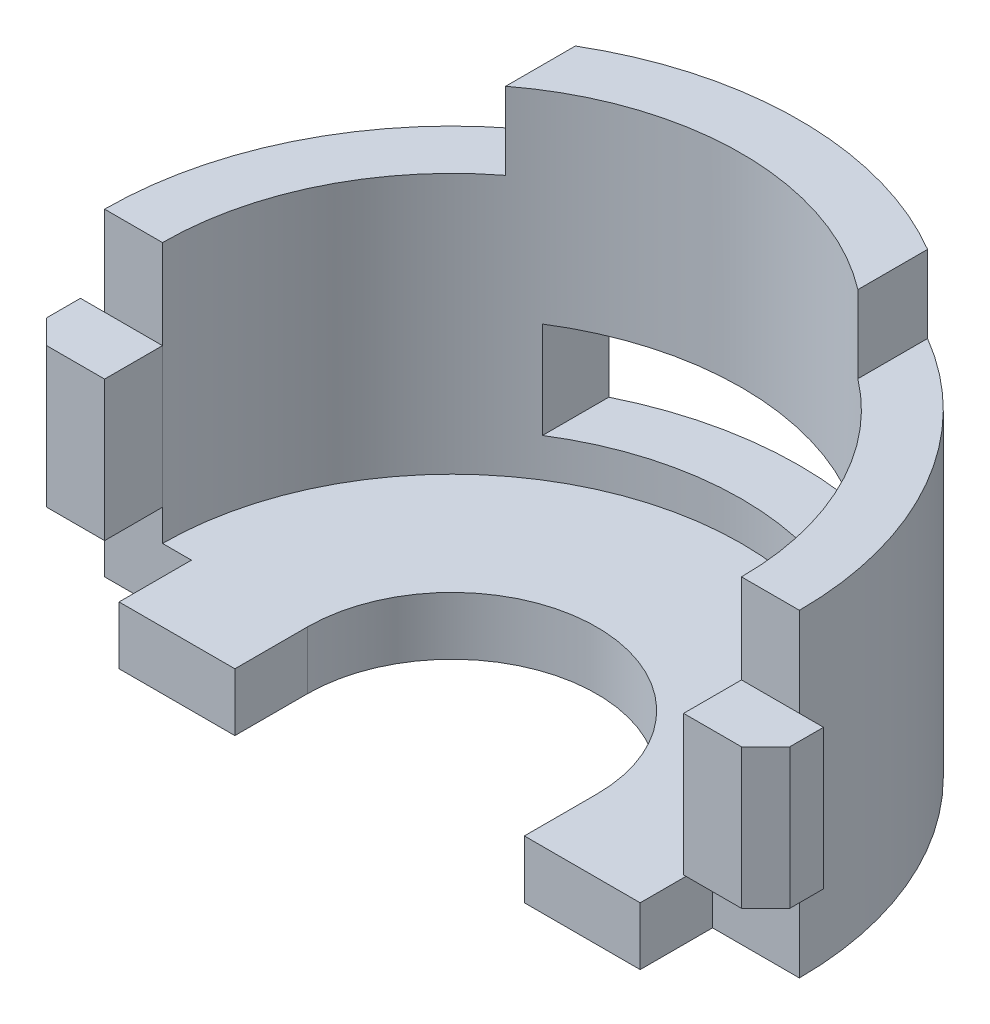
ISO-10303-21;
HEADER;
FILE_DESCRIPTION(('STEP AP214'),'2;1');
FILE_NAME('part.step','',(''),(''),'','','');
FILE_SCHEMA(('AUTOMOTIVE_DESIGN { 1 0 10303 214 1 1 1 1 }'));
ENDSEC;
DATA;
#1=APPLICATION_CONTEXT('core data for automotive mechanical design processes');
#2=APPLICATION_PROTOCOL_DEFINITION('international standard','automotive_design',2000,#1);
#3=PRODUCT_CONTEXT('',#1,'mechanical');
#4=PRODUCT('Part','Part','',(#3));
#5=PRODUCT_RELATED_PRODUCT_CATEGORY('part','',(#4));
#6=PRODUCT_DEFINITION_FORMATION('','',#4);
#7=PRODUCT_DEFINITION_CONTEXT('part definition',#1,'design');
#8=PRODUCT_DEFINITION('design','',#6,#7);
#9=PRODUCT_DEFINITION_SHAPE('','',#8);
#10=(LENGTH_UNIT() NAMED_UNIT(*) SI_UNIT(.MILLI.,.METRE.));
#11=(NAMED_UNIT(*) PLANE_ANGLE_UNIT() SI_UNIT($,.RADIAN.));
#12=(NAMED_UNIT(*) SI_UNIT($,.STERADIAN.) SOLID_ANGLE_UNIT());
#13=UNCERTAINTY_MEASURE_WITH_UNIT(LENGTH_MEASURE(1.E-05),#10,'distance_accuracy_value','');
#14=(GEOMETRIC_REPRESENTATION_CONTEXT(3) GLOBAL_UNCERTAINTY_ASSIGNED_CONTEXT((#13)) GLOBAL_UNIT_ASSIGNED_CONTEXT((#10,
#11,#12)) REPRESENTATION_CONTEXT('',''));
#15=CARTESIAN_POINT('',(0.,0.,0.));
#16=DIRECTION('',(0.,0.,1.));
#17=DIRECTION('',(1.,0.,0.));
#18=AXIS2_PLACEMENT_3D('',#15,#16,#17);
#19=CARTESIAN_POINT('',(0.,0.,0.));
#20=DIRECTION('',(0.,0.,-1.));
#21=DIRECTION('',(-1.,0.,0.));
#22=AXIS2_PLACEMENT_3D('',#19,#20,#21);
#23=PLANE('',#22);
#24=DIRECTION('',(-1.,0.,0.));
#25=VECTOR('',#24,1.);
#26=CARTESIAN_POINT('',(7.7,3.55,0.));
#27=LINE('',#26,#25);
#28=CARTESIAN_POINT('',(7.2,3.55,0.));
#29=VERTEX_POINT('',#28);
#30=CARTESIAN_POINT('',(6.,3.55,0.));
#31=VERTEX_POINT('',#30);
#32=EDGE_CURVE('E280',#29,#31,#27,.T.);
#33=ORIENTED_EDGE('',*,*,#32,.F.);
#34=DIRECTION('',(0.,-1.,0.));
#35=VECTOR('',#34,1.);
#36=CARTESIAN_POINT('',(7.2,0.,0.));
#37=LINE('',#36,#35);
#38=CARTESIAN_POINT('',(7.2,5.4,0.));
#39=VERTEX_POINT('',#38);
#40=EDGE_CURVE('E500',#39,#29,#37,.T.);
#41=ORIENTED_EDGE('',*,*,#40,.F.);
#42=DIRECTION('',(1.,0.,0.));
#43=VECTOR('',#42,1.);
#44=CARTESIAN_POINT('',(0.,5.4,0.));
#45=LINE('',#44,#43);
#46=CARTESIAN_POINT('',(6.,5.4,0.));
#47=VERTEX_POINT('',#46);
#48=EDGE_CURVE('E504',#47,#39,#45,.T.);
#49=ORIENTED_EDGE('',*,*,#48,.F.);
#50=DIRECTION('',(0.,1.,0.));
#51=VECTOR('',#50,1.);
#52=CARTESIAN_POINT('',(6.,0.,0.));
#53=LINE('',#52,#51);
#54=EDGE_CURVE('E508',#31,#47,#53,.T.);
#55=ORIENTED_EDGE('',*,*,#54,.F.);
#56=EDGE_LOOP('',(#33,#41,#49,#55));
#57=FACE_BOUND('',#56,.T.);
#58=ADVANCED_FACE('F48',(#57),#23,.F.);
#59=CARTESIAN_POINT('',(7.2,0.650000000000001,0.));
#60=VERTEX_POINT('',#59);
#61=CARTESIAN_POINT('',(7.2,-1.2,0.));
#62=VERTEX_POINT('',#61);
#63=EDGE_CURVE('E499',#60,#62,#37,.T.);
#64=ORIENTED_EDGE('',*,*,#63,.F.);
#65=DIRECTION('',(-1.,0.,0.));
#66=VECTOR('',#65,1.);
#67=CARTESIAN_POINT('',(7.7,0.650000000000001,0.));
#68=LINE('',#67,#66);
#69=CARTESIAN_POINT('',(6.,0.650000000000001,0.));
#70=VERTEX_POINT('',#69);
#71=EDGE_CURVE('E279',#60,#70,#68,.T.);
#72=ORIENTED_EDGE('',*,*,#71,.T.);
#73=CARTESIAN_POINT('',(6.,0.,0.));
#74=VERTEX_POINT('',#73);
#75=EDGE_CURVE('E509',#74,#70,#53,.T.);
#76=ORIENTED_EDGE('',*,*,#75,.F.);
#77=DIRECTION('',(-1.,0.,0.));
#78=VECTOR('',#77,1.);
#79=CARTESIAN_POINT('',(0.,0.,0.));
#80=LINE('',#79,#78);
#81=CARTESIAN_POINT('',(5.4,0.,0.));
#82=VERTEX_POINT('',#81);
#83=EDGE_CURVE('E532',#74,#82,#80,.T.);
#84=ORIENTED_EDGE('',*,*,#83,.T.);
#85=DIRECTION('',(0.,1.,0.));
#86=VECTOR('',#85,1.);
#87=CARTESIAN_POINT('',(5.4,-4.03019433961699,0.));
#88=LINE('',#87,#86);
#89=CARTESIAN_POINT('',(5.4,-1.2,0.));
#90=VERTEX_POINT('',#89);
#91=EDGE_CURVE('E339',#90,#82,#88,.T.);
#92=ORIENTED_EDGE('',*,*,#91,.F.);
#93=DIRECTION('',(1.,0.,0.));
#94=VECTOR('',#93,1.);
#95=CARTESIAN_POINT('',(0.,-1.2,0.));
#96=LINE('',#95,#94);
#97=EDGE_CURVE('E513',#90,#62,#96,.T.);
#98=ORIENTED_EDGE('',*,*,#97,.T.);
#99=EDGE_LOOP('',(#64,#72,#76,#84,#92,#98));
#100=FACE_BOUND('',#99,.T.);
#101=ADVANCED_FACE('F626',(#100),#23,.F.);
#102=DIRECTION('',(1.,0.,0.));
#103=VECTOR('',#102,1.);
#104=CARTESIAN_POINT('',(-7.7,0.650000000000001,0.));
#105=LINE('',#104,#103);
#106=CARTESIAN_POINT('',(-7.2,0.649999999999999,0.));
#107=VERTEX_POINT('',#106);
#108=CARTESIAN_POINT('',(-6.,0.650000000000001,0.));
#109=VERTEX_POINT('',#108);
#110=EDGE_CURVE('E389',#107,#109,#105,.T.);
#111=ORIENTED_EDGE('',*,*,#110,.F.);
#112=DIRECTION('',(0.,-1.,0.));
#113=VECTOR('',#112,1.);
#114=CARTESIAN_POINT('',(-7.2,0.,0.));
#115=LINE('',#114,#113);
#116=CARTESIAN_POINT('',(-7.2,-1.2,0.));
#117=VERTEX_POINT('',#116);
#118=EDGE_CURVE('E517',#107,#117,#115,.T.);
#119=ORIENTED_EDGE('',*,*,#118,.T.);
#120=CARTESIAN_POINT('',(-5.4,-1.2,0.));
#121=VERTEX_POINT('',#120);
#122=EDGE_CURVE('E514',#117,#121,#96,.T.);
#123=ORIENTED_EDGE('',*,*,#122,.T.);
#124=DIRECTION('',(0.,1.,0.));
#125=VECTOR('',#124,1.);
#126=CARTESIAN_POINT('',(-5.4,-4.03019433961699,0.));
#127=LINE('',#126,#125);
#128=CARTESIAN_POINT('',(-5.4,0.,0.));
#129=VERTEX_POINT('',#128);
#130=EDGE_CURVE('E421',#121,#129,#127,.T.);
#131=ORIENTED_EDGE('',*,*,#130,.T.);
#132=CARTESIAN_POINT('',(-6.,0.,0.));
#133=VERTEX_POINT('',#132);
#134=EDGE_CURVE('E531',#129,#133,#80,.T.);
#135=ORIENTED_EDGE('',*,*,#134,.T.);
#136=DIRECTION('',(0.,1.,0.));
#137=VECTOR('',#136,1.);
#138=CARTESIAN_POINT('',(-6.,0.,0.));
#139=LINE('',#138,#137);
#140=EDGE_CURVE('E527',#133,#109,#139,.T.);
#141=ORIENTED_EDGE('',*,*,#140,.T.);
#142=EDGE_LOOP('',(#111,#119,#123,#131,#135,#141));
#143=FACE_BOUND('',#142,.T.);
#144=ADVANCED_FACE('F672',(#143),#23,.F.);
#145=CARTESIAN_POINT('',(-7.2,5.4,0.));
#146=VERTEX_POINT('',#145);
#147=CARTESIAN_POINT('',(-7.2,3.55,0.));
#148=VERTEX_POINT('',#147);
#149=EDGE_CURVE('E518',#146,#148,#115,.T.);
#150=ORIENTED_EDGE('',*,*,#149,.T.);
#151=DIRECTION('',(1.,0.,0.));
#152=VECTOR('',#151,1.);
#153=CARTESIAN_POINT('',(-7.7,3.55,0.));
#154=LINE('',#153,#152);
#155=CARTESIAN_POINT('',(-6.,3.55,0.));
#156=VERTEX_POINT('',#155);
#157=EDGE_CURVE('E384',#148,#156,#154,.T.);
#158=ORIENTED_EDGE('',*,*,#157,.T.);
#159=CARTESIAN_POINT('',(-6.,5.4,0.));
#160=VERTEX_POINT('',#159);
#161=EDGE_CURVE('E526',#156,#160,#139,.T.);
#162=ORIENTED_EDGE('',*,*,#161,.T.);
#163=DIRECTION('',(-1.,0.,0.));
#164=VECTOR('',#163,1.);
#165=CARTESIAN_POINT('',(0.,5.4,0.));
#166=LINE('',#165,#164);
#167=EDGE_CURVE('E522',#160,#146,#166,.T.);
#168=ORIENTED_EDGE('',*,*,#167,.T.);
#169=EDGE_LOOP('',(#150,#158,#162,#168));
#170=FACE_BOUND('',#169,.T.);
#171=ADVANCED_FACE('F658',(#170),#23,.F.);
#172=CARTESIAN_POINT('',(0.,5.4,0.));
#173=DIRECTION('',(0.,-1.,0.));
#174=DIRECTION('',(0.,0.,-1.));
#175=AXIS2_PLACEMENT_3D('',#172,#173,#174);
#176=PLANE('',#175);
#177=DIRECTION('',(0.,0.,1.));
#178=VECTOR('',#177,1.);
#179=CARTESIAN_POINT('',(-3.65,5.4,0.));
#180=LINE('',#179,#178);
#181=CARTESIAN_POINT('',(-3.65,5.4,-6.20624685297));
#182=VERTEX_POINT('',#181);
#183=CARTESIAN_POINT('',(-3.65,5.4,-4.76208987735427));
#184=VERTEX_POINT('',#183);
#185=EDGE_CURVE('E496',#182,#184,#180,.T.);
#186=ORIENTED_EDGE('',*,*,#185,.F.);
#187=CARTESIAN_POINT('',(0.,5.4,0.));
#188=DIRECTION('',(0.,-1.,0.));
#189=DIRECTION('',(0.,0.,-1.));
#190=AXIS2_PLACEMENT_3D('',#187,#188,#189);
#191=CIRCLE('',#190,7.2);
#192=EDGE_CURVE('E544',#146,#182,#191,.T.);
#193=ORIENTED_EDGE('',*,*,#192,.F.);
#194=ORIENTED_EDGE('',*,*,#167,.F.);
#195=CARTESIAN_POINT('',(0.,5.4,0.));
#196=DIRECTION('',(0.,-1.,0.));
#197=DIRECTION('',(0.,0.,-1.));
#198=AXIS2_PLACEMENT_3D('',#195,#196,#197);
#199=CIRCLE('',#198,6.);
#200=EDGE_CURVE('E539',#160,#184,#199,.T.);
#201=ORIENTED_EDGE('',*,*,#200,.T.);
#202=EDGE_LOOP('',(#186,#193,#194,#201));
#203=FACE_BOUND('',#202,.T.);
#204=ADVANCED_FACE('F652',(#203),#176,.F.);
#205=CARTESIAN_POINT('',(0.,-1.2,0.));
#206=DIRECTION('',(0.,1.,0.));
#207=DIRECTION('',(0.,0.,1.));
#208=AXIS2_PLACEMENT_3D('',#205,#206,#207);
#209=PLANE('',#208);
#210=ORIENTED_EDGE('',*,*,#97,.F.);
#211=DIRECTION('',(0.,0.,-1.));
#212=VECTOR('',#211,1.);
#213=CARTESIAN_POINT('',(5.4,-1.2,0.));
#214=LINE('',#213,#212);
#215=CARTESIAN_POINT('',(5.4,-1.2,1.50000000000002));
#216=VERTEX_POINT('',#215);
#217=EDGE_CURVE('E317',#216,#90,#214,.T.);
#218=ORIENTED_EDGE('',*,*,#217,.F.);
#219=DIRECTION('',(1.,0.,0.));
#220=VECTOR('',#219,1.);
#221=CARTESIAN_POINT('',(3.,-1.2,1.50000000000002));
#222=LINE('',#221,#220);
#223=CARTESIAN_POINT('',(3.,-1.2,1.50000000000002));
#224=VERTEX_POINT('',#223);
#225=EDGE_CURVE('E322',#224,#216,#222,.T.);
#226=ORIENTED_EDGE('',*,*,#225,.F.);
#227=DIRECTION('',(0.,0.,1.));
#228=VECTOR('',#227,1.);
#229=CARTESIAN_POINT('',(3.,-1.2,0.));
#230=LINE('',#229,#228);
#231=CARTESIAN_POINT('',(3.,-1.2,0.));
#232=VERTEX_POINT('',#231);
#233=EDGE_CURVE('E321',#232,#224,#230,.T.);
#234=ORIENTED_EDGE('',*,*,#233,.F.);
#235=CARTESIAN_POINT('',(0.,-1.2,0.));
#236=DIRECTION('',(0.,1.,0.));
#237=DIRECTION('',(0.,0.,1.));
#238=AXIS2_PLACEMENT_3D('',#235,#236,#237);
#239=CIRCLE('',#238,3.);
#240=CARTESIAN_POINT('',(-3.,-1.2,0.));
#241=VERTEX_POINT('',#240);
#242=EDGE_CURVE('E431',#232,#241,#239,.T.);
#243=ORIENTED_EDGE('',*,*,#242,.T.);
#244=DIRECTION('',(0.,0.,1.));
#245=VECTOR('',#244,1.);
#246=CARTESIAN_POINT('',(-3.,-1.2,0.));
#247=LINE('',#246,#245);
#248=CARTESIAN_POINT('',(-3.,-1.2,1.50000000000002));
#249=VERTEX_POINT('',#248);
#250=EDGE_CURVE('E406',#241,#249,#247,.T.);
#251=ORIENTED_EDGE('',*,*,#250,.T.);
#252=DIRECTION('',(-1.,0.,0.));
#253=VECTOR('',#252,1.);
#254=CARTESIAN_POINT('',(-3.,-1.2,1.50000000000002));
#255=LINE('',#254,#253);
#256=CARTESIAN_POINT('',(-5.4,-1.2,1.50000000000002));
#257=VERTEX_POINT('',#256);
#258=EDGE_CURVE('E402',#249,#257,#255,.T.);
#259=ORIENTED_EDGE('',*,*,#258,.T.);
#260=DIRECTION('',(0.,0.,-1.));
#261=VECTOR('',#260,1.);
#262=CARTESIAN_POINT('',(-5.4,-1.2,0.));
#263=LINE('',#262,#261);
#264=EDGE_CURVE('E398',#257,#121,#263,.T.);
#265=ORIENTED_EDGE('',*,*,#264,.T.);
#266=ORIENTED_EDGE('',*,*,#122,.F.);
#267=CARTESIAN_POINT('',(0.,-1.2,0.));
#268=DIRECTION('',(0.,-1.,0.));
#269=DIRECTION('',(0.,0.,-1.));
#270=AXIS2_PLACEMENT_3D('',#267,#268,#269);
#271=CIRCLE('',#270,7.2);
#272=EDGE_CURVE('E548',#117,#62,#271,.T.);
#273=ORIENTED_EDGE('',*,*,#272,.T.);
#274=EDGE_LOOP('',(#210,#218,#226,#234,#243,#251,#259,#265,#266,#273));
#275=FACE_BOUND('',#274,.T.);
#276=ADVANCED_FACE('F711',(#275),#209,.F.);
#277=CARTESIAN_POINT('',(0.,-1.2,0.));
#278=DIRECTION('',(0.,-1.,0.));
#279=DIRECTION('',(0.,0.,-1.));
#280=AXIS2_PLACEMENT_3D('',#277,#278,#279);
#281=CYLINDRICAL_SURFACE('',#280,7.2);
#282=CARTESIAN_POINT('',(0.,2.8,0.));
#283=DIRECTION('',(0.,1.,0.));
#284=DIRECTION('',(-1.,0.,0.));
#285=AXIS2_PLACEMENT_3D('',#282,#283,#284);
#286=CIRCLE('',#285,7.2);
#287=CARTESIAN_POINT('',(3.2,2.8,-6.44980619863884));
#288=VERTEX_POINT('',#287);
#289=CARTESIAN_POINT('',(-3.2,2.8,-6.44980619863884));
#290=VERTEX_POINT('',#289);
#291=EDGE_CURVE('E458',#288,#290,#286,.T.);
#292=ORIENTED_EDGE('',*,*,#291,.T.);
#293=DIRECTION('',(0.,-1.,0.));
#294=VECTOR('',#293,1.);
#295=CARTESIAN_POINT('',(-3.2,-1.2,-6.44980619863884));
#296=LINE('',#295,#294);
#297=CARTESIAN_POINT('',(-3.2,0.800000000000001,-6.44980619863884));
#298=VERTEX_POINT('',#297);
#299=EDGE_CURVE('E462',#290,#298,#296,.T.);
#300=ORIENTED_EDGE('',*,*,#299,.T.);
#301=CARTESIAN_POINT('',(0.,0.800000000000001,0.));
#302=DIRECTION('',(0.,-1.,0.));
#303=DIRECTION('',(1.,0.,0.));
#304=AXIS2_PLACEMENT_3D('',#301,#302,#303);
#305=CIRCLE('',#304,7.2);
#306=CARTESIAN_POINT('',(3.2,0.800000000000001,-6.44980619863884));
#307=VERTEX_POINT('',#306);
#308=EDGE_CURVE('E440',#298,#307,#305,.T.);
#309=ORIENTED_EDGE('',*,*,#308,.T.);
#310=DIRECTION('',(0.,-1.,0.));
#311=VECTOR('',#310,1.);
#312=CARTESIAN_POINT('',(3.2,-1.2,-6.44980619863884));
#313=LINE('',#312,#311);
#314=EDGE_CURVE('E454',#307,#288,#313,.F.);
#315=ORIENTED_EDGE('',*,*,#314,.T.);
#316=EDGE_LOOP('',(#292,#300,#309,#315));
#317=FACE_BOUND('',#316,.T.);
#318=ORIENTED_EDGE('',*,*,#40,.T.);
#319=DIRECTION('',(0.,-1.,0.));
#320=VECTOR('',#319,1.);
#321=CARTESIAN_POINT('',(7.2,-1.2,0.));
#322=LINE('',#321,#320);
#323=EDGE_CURVE('E274',#60,#29,#322,.F.);
#324=ORIENTED_EDGE('',*,*,#323,.F.);
#325=ORIENTED_EDGE('',*,*,#63,.T.);
#326=ORIENTED_EDGE('',*,*,#272,.F.);
#327=ORIENTED_EDGE('',*,*,#118,.F.);
#328=DIRECTION('',(0.,-1.,0.));
#329=VECTOR('',#328,1.);
#330=CARTESIAN_POINT('',(-7.2,-1.2,0.));
#331=LINE('',#330,#329);
#332=EDGE_CURVE('E383',#107,#148,#331,.F.);
#333=ORIENTED_EDGE('',*,*,#332,.T.);
#334=ORIENTED_EDGE('',*,*,#149,.F.);
#335=ORIENTED_EDGE('',*,*,#192,.T.);
#336=DIRECTION('',(0.,-1.,0.));
#337=VECTOR('',#336,1.);
#338=CARTESIAN_POINT('',(-3.65,-1.61,-6.20624685297));
#339=LINE('',#338,#337);
#340=CARTESIAN_POINT('',(-3.65,7.,-6.20624685297));
#341=VERTEX_POINT('',#340);
#342=EDGE_CURVE('E483',#341,#182,#339,.T.);
#343=ORIENTED_EDGE('',*,*,#342,.F.);
#344=CARTESIAN_POINT('',(0.,7.,0.));
#345=DIRECTION('',(0.,-1.,0.));
#346=DIRECTION('',(0.,0.,-1.));
#347=AXIS2_PLACEMENT_3D('',#344,#345,#346);
#348=CIRCLE('',#347,7.2);
#349=CARTESIAN_POINT('',(3.65,7.,-6.20624685297));
#350=VERTEX_POINT('',#349);
#351=EDGE_CURVE('E476',#341,#350,#348,.T.);
#352=ORIENTED_EDGE('',*,*,#351,.T.);
#353=DIRECTION('',(0.,1.,0.));
#354=VECTOR('',#353,1.);
#355=CARTESIAN_POINT('',(3.65,-1.61,-6.20624685297));
#356=LINE('',#355,#354);
#357=CARTESIAN_POINT('',(3.65,5.4,-6.20624685297));
#358=VERTEX_POINT('',#357);
#359=EDGE_CURVE('E473',#358,#350,#356,.T.);
#360=ORIENTED_EDGE('',*,*,#359,.F.);
#361=EDGE_CURVE('E543',#358,#39,#191,.T.);
#362=ORIENTED_EDGE('',*,*,#361,.T.);
#363=EDGE_LOOP('',(#318,#324,#325,#326,#327,#333,#334,#335,#343,#352,#360,#362));
#364=FACE_BOUND('',#363,.T.);
#365=ADVANCED_FACE('F630',(#317,#364),#281,.T.);
#366=ORIENTED_EDGE('',*,*,#361,.F.);
#367=DIRECTION('',(0.,0.,1.));
#368=VECTOR('',#367,1.);
#369=CARTESIAN_POINT('',(3.65,5.4,0.));
#370=LINE('',#369,#368);
#371=CARTESIAN_POINT('',(3.65,5.4,-4.76208987735427));
#372=VERTEX_POINT('',#371);
#373=EDGE_CURVE('E487',#358,#372,#370,.T.);
#374=ORIENTED_EDGE('',*,*,#373,.T.);
#375=EDGE_CURVE('E538',#372,#47,#199,.T.);
#376=ORIENTED_EDGE('',*,*,#375,.T.);
#377=ORIENTED_EDGE('',*,*,#48,.T.);
#378=EDGE_LOOP('',(#366,#374,#376,#377));
#379=FACE_BOUND('',#378,.T.);
#380=ADVANCED_FACE('F634',(#379),#176,.F.);
#381=CARTESIAN_POINT('',(0.,-1.2,0.));
#382=DIRECTION('',(0.,-1.,0.));
#383=DIRECTION('',(0.,0.,-1.));
#384=AXIS2_PLACEMENT_3D('',#381,#382,#383);
#385=CYLINDRICAL_SURFACE('',#384,6.);
#386=CARTESIAN_POINT('',(0.,0.800000000000001,0.));
#387=DIRECTION('',(0.,-1.,0.));
#388=DIRECTION('',(1.,0.,0.));
#389=AXIS2_PLACEMENT_3D('',#386,#387,#388);
#390=CIRCLE('',#389,6.);
#391=CARTESIAN_POINT('',(3.2,0.800000000000001,-5.07543101617981));
#392=VERTEX_POINT('',#391);
#393=CARTESIAN_POINT('',(-3.2,0.800000000000001,-5.07543101617981));
#394=VERTEX_POINT('',#393);
#395=EDGE_CURVE('E552',#392,#394,#390,.F.);
#396=ORIENTED_EDGE('',*,*,#395,.T.);
#397=DIRECTION('',(0.,-1.,0.));
#398=VECTOR('',#397,1.);
#399=CARTESIAN_POINT('',(-3.2,-1.2,-5.07543101617981));
#400=LINE('',#399,#398);
#401=CARTESIAN_POINT('',(-3.2,2.8,-5.07543101617981));
#402=VERTEX_POINT('',#401);
#403=EDGE_CURVE('E564',#394,#402,#400,.F.);
#404=ORIENTED_EDGE('',*,*,#403,.T.);
#405=CARTESIAN_POINT('',(0.,2.8,0.));
#406=DIRECTION('',(0.,1.,0.));
#407=DIRECTION('',(-1.,0.,0.));
#408=AXIS2_PLACEMENT_3D('',#405,#406,#407);
#409=CIRCLE('',#408,6.);
#410=CARTESIAN_POINT('',(3.2,2.8,-5.07543101617981));
#411=VERTEX_POINT('',#410);
#412=EDGE_CURVE('E560',#402,#411,#409,.F.);
#413=ORIENTED_EDGE('',*,*,#412,.T.);
#414=DIRECTION('',(0.,-1.,0.));
#415=VECTOR('',#414,1.);
#416=CARTESIAN_POINT('',(3.2,-1.2,-5.07543101617981));
#417=LINE('',#416,#415);
#418=EDGE_CURVE('E556',#411,#392,#417,.T.);
#419=ORIENTED_EDGE('',*,*,#418,.T.);
#420=EDGE_LOOP('',(#396,#404,#413,#419));
#421=FACE_BOUND('',#420,.T.);
#422=ORIENTED_EDGE('',*,*,#375,.F.);
#423=DIRECTION('',(0.,1.,0.));
#424=VECTOR('',#423,1.);
#425=CARTESIAN_POINT('',(3.65,-1.61,-4.76208987735427));
#426=LINE('',#425,#424);
#427=CARTESIAN_POINT('',(3.65,7.,-4.76208987735427));
#428=VERTEX_POINT('',#427);
#429=EDGE_CURVE('E466',#428,#372,#426,.F.);
#430=ORIENTED_EDGE('',*,*,#429,.F.);
#431=CARTESIAN_POINT('',(0.,7.,0.));
#432=DIRECTION('',(0.,-1.,0.));
#433=DIRECTION('',(0.,0.,-1.));
#434=AXIS2_PLACEMENT_3D('',#431,#432,#433);
#435=CIRCLE('',#434,6.);
#436=CARTESIAN_POINT('',(-3.65,7.,-4.76208987735427));
#437=VERTEX_POINT('',#436);
#438=EDGE_CURVE('E480',#437,#428,#435,.T.);
#439=ORIENTED_EDGE('',*,*,#438,.F.);
#440=DIRECTION('',(0.,-1.,0.));
#441=VECTOR('',#440,1.);
#442=CARTESIAN_POINT('',(-3.65,-1.61,-4.76208987735427));
#443=LINE('',#442,#441);
#444=EDGE_CURVE('E488',#184,#437,#443,.F.);
#445=ORIENTED_EDGE('',*,*,#444,.F.);
#446=ORIENTED_EDGE('',*,*,#200,.F.);
#447=ORIENTED_EDGE('',*,*,#161,.F.);
#448=DIRECTION('',(0.,1.,0.));
#449=VECTOR('',#448,1.);
#450=CARTESIAN_POINT('',(-6.,0.,0.));
#451=LINE('',#450,#449);
#452=EDGE_CURVE('E356',#109,#156,#451,.T.);
#453=ORIENTED_EDGE('',*,*,#452,.F.);
#454=ORIENTED_EDGE('',*,*,#140,.F.);
#455=CARTESIAN_POINT('',(0.,0.,0.));
#456=DIRECTION('',(0.,-1.,0.));
#457=DIRECTION('',(0.,0.,-1.));
#458=AXIS2_PLACEMENT_3D('',#455,#456,#457);
#459=CIRCLE('',#458,6.);
#460=EDGE_CURVE('E535',#133,#74,#459,.T.);
#461=ORIENTED_EDGE('',*,*,#460,.T.);
#462=ORIENTED_EDGE('',*,*,#75,.T.);
#463=DIRECTION('',(0.,1.,0.));
#464=VECTOR('',#463,1.);
#465=CARTESIAN_POINT('',(6.,0.,0.));
#466=LINE('',#465,#464);
#467=EDGE_CURVE('E298',#70,#31,#466,.T.);
#468=ORIENTED_EDGE('',*,*,#467,.T.);
#469=ORIENTED_EDGE('',*,*,#54,.T.);
#470=EDGE_LOOP('',(#422,#430,#439,#445,#446,#447,#453,#454,#461,#462,#468,#469));
#471=FACE_BOUND('',#470,.T.);
#472=ADVANCED_FACE('F617',(#421,#471),#385,.F.);
#473=CARTESIAN_POINT('',(0.,0.,0.));
#474=DIRECTION('',(0.,-1.,0.));
#475=DIRECTION('',(0.,0.,-1.));
#476=AXIS2_PLACEMENT_3D('',#473,#474,#475);
#477=PLANE('',#476);
#478=ORIENTED_EDGE('',*,*,#134,.F.);
#479=DIRECTION('',(0.,0.,1.));
#480=VECTOR('',#479,1.);
#481=CARTESIAN_POINT('',(-5.4,0.,0.));
#482=LINE('',#481,#480);
#483=CARTESIAN_POINT('',(-5.4,0.,1.50000000000002));
#484=VERTEX_POINT('',#483);
#485=EDGE_CURVE('E413',#129,#484,#482,.T.);
#486=ORIENTED_EDGE('',*,*,#485,.T.);
#487=DIRECTION('',(1.,0.,0.));
#488=VECTOR('',#487,1.);
#489=CARTESIAN_POINT('',(-3.,0.,1.50000000000002));
#490=LINE('',#489,#488);
#491=CARTESIAN_POINT('',(-3.,0.,1.50000000000002));
#492=VERTEX_POINT('',#491);
#493=EDGE_CURVE('E417',#484,#492,#490,.T.);
#494=ORIENTED_EDGE('',*,*,#493,.T.);
#495=DIRECTION('',(0.,0.,-1.));
#496=VECTOR('',#495,1.);
#497=CARTESIAN_POINT('',(-3.,0.,0.));
#498=LINE('',#497,#496);
#499=CARTESIAN_POINT('',(-3.,0.,0.));
#500=VERTEX_POINT('',#499);
#501=EDGE_CURVE('E397',#492,#500,#498,.T.);
#502=ORIENTED_EDGE('',*,*,#501,.T.);
#503=CARTESIAN_POINT('',(0.,0.,0.));
#504=DIRECTION('',(0.,1.,0.));
#505=DIRECTION('',(0.,0.,1.));
#506=AXIS2_PLACEMENT_3D('',#503,#504,#505);
#507=CIRCLE('',#506,3.);
#508=CARTESIAN_POINT('',(3.,0.,0.));
#509=VERTEX_POINT('',#508);
#510=EDGE_CURVE('E409',#509,#500,#507,.T.);
#511=ORIENTED_EDGE('',*,*,#510,.F.);
#512=DIRECTION('',(0.,0.,-1.));
#513=VECTOR('',#512,1.);
#514=CARTESIAN_POINT('',(3.,0.,0.));
#515=LINE('',#514,#513);
#516=CARTESIAN_POINT('',(3.,0.,1.50000000000002));
#517=VERTEX_POINT('',#516);
#518=EDGE_CURVE('E316',#517,#509,#515,.T.);
#519=ORIENTED_EDGE('',*,*,#518,.F.);
#520=DIRECTION('',(-1.,0.,0.));
#521=VECTOR('',#520,1.);
#522=CARTESIAN_POINT('',(3.,0.,1.50000000000002));
#523=LINE('',#522,#521);
#524=CARTESIAN_POINT('',(5.4,0.,1.50000000000002));
#525=VERTEX_POINT('',#524);
#526=EDGE_CURVE('E330',#525,#517,#523,.T.);
#527=ORIENTED_EDGE('',*,*,#526,.F.);
#528=DIRECTION('',(0.,0.,1.));
#529=VECTOR('',#528,1.);
#530=CARTESIAN_POINT('',(5.4,0.,0.));
#531=LINE('',#530,#529);
#532=EDGE_CURVE('E334',#82,#525,#531,.T.);
#533=ORIENTED_EDGE('',*,*,#532,.F.);
#534=ORIENTED_EDGE('',*,*,#83,.F.);
#535=ORIENTED_EDGE('',*,*,#460,.F.);
#536=EDGE_LOOP('',(#478,#486,#494,#502,#511,#519,#527,#533,#534,#535));
#537=FACE_BOUND('',#536,.T.);
#538=ADVANCED_FACE('F725',(#537),#477,.F.);
#539=CARTESIAN_POINT('',(-3.65,0.,0.));
#540=DIRECTION('',(1.,0.,0.));
#541=DIRECTION('',(0.,0.,-1.));
#542=AXIS2_PLACEMENT_3D('',#539,#540,#541);
#543=PLANE('',#542);
#544=ORIENTED_EDGE('',*,*,#342,.T.);
#545=ORIENTED_EDGE('',*,*,#185,.T.);
#546=ORIENTED_EDGE('',*,*,#444,.T.);
#547=DIRECTION('',(0.,0.,-1.));
#548=VECTOR('',#547,1.);
#549=CARTESIAN_POINT('',(-3.65,7.,-7.19999999890338));
#550=LINE('',#549,#548);
#551=EDGE_CURVE('E484',#437,#341,#550,.T.);
#552=ORIENTED_EDGE('',*,*,#551,.T.);
#553=EDGE_LOOP('',(#544,#545,#546,#552));
#554=FACE_BOUND('',#553,.T.);
#555=ADVANCED_FACE('F647',(#554),#543,.F.);
#556=CARTESIAN_POINT('',(3.65,0.,0.));
#557=DIRECTION('',(1.,0.,0.));
#558=DIRECTION('',(0.,0.,-1.));
#559=AXIS2_PLACEMENT_3D('',#556,#557,#558);
#560=PLANE('',#559);
#561=ORIENTED_EDGE('',*,*,#373,.F.);
#562=ORIENTED_EDGE('',*,*,#359,.T.);
#563=DIRECTION('',(0.,0.,1.));
#564=VECTOR('',#563,1.);
#565=CARTESIAN_POINT('',(3.65,7.,-7.19999999890338));
#566=LINE('',#565,#564);
#567=EDGE_CURVE('E469',#350,#428,#566,.T.);
#568=ORIENTED_EDGE('',*,*,#567,.T.);
#569=ORIENTED_EDGE('',*,*,#429,.T.);
#570=EDGE_LOOP('',(#561,#562,#568,#569));
#571=FACE_BOUND('',#570,.T.);
#572=ADVANCED_FACE('F640',(#571),#560,.T.);
#573=CARTESIAN_POINT('',(0.000125663706034731,7.,-7.19999999890338));
#574=DIRECTION('',(0.,1.,0.));
#575=DIRECTION('',(0.,0.,1.));
#576=AXIS2_PLACEMENT_3D('',#573,#574,#575);
#577=PLANE('',#576);
#578=ORIENTED_EDGE('',*,*,#551,.F.);
#579=ORIENTED_EDGE('',*,*,#438,.T.);
#580=ORIENTED_EDGE('',*,*,#567,.F.);
#581=ORIENTED_EDGE('',*,*,#351,.F.);
#582=EDGE_LOOP('',(#578,#579,#580,#581));
#583=FACE_BOUND('',#582,.T.);
#584=ADVANCED_FACE('F644',(#583),#577,.T.);
#585=CARTESIAN_POINT('',(-3.2,0.800000000000001,-10.));
#586=DIRECTION('',(-1.,0.,0.));
#587=DIRECTION('',(0.,-1.,0.));
#588=AXIS2_PLACEMENT_3D('',#585,#586,#587);
#589=PLANE('',#588);
#590=DIRECTION('',(0.,0.,1.));
#591=VECTOR('',#590,1.);
#592=CARTESIAN_POINT('',(-3.2,2.8,-10.));
#593=LINE('',#592,#591);
#594=EDGE_CURVE('E436',#290,#402,#593,.T.);
#595=ORIENTED_EDGE('',*,*,#594,.T.);
#596=ORIENTED_EDGE('',*,*,#403,.F.);
#597=DIRECTION('',(0.,0.,1.));
#598=VECTOR('',#597,1.);
#599=CARTESIAN_POINT('',(-3.2,0.800000000000001,-10.));
#600=LINE('',#599,#598);
#601=EDGE_CURVE('E435',#298,#394,#600,.T.);
#602=ORIENTED_EDGE('',*,*,#601,.F.);
#603=ORIENTED_EDGE('',*,*,#299,.F.);
#604=EDGE_LOOP('',(#595,#596,#602,#603));
#605=FACE_BOUND('',#604,.T.);
#606=ADVANCED_FACE('F776',(#605),#589,.F.);
#607=CARTESIAN_POINT('',(3.2,2.8,-10.));
#608=DIRECTION('',(0.,1.,0.));
#609=DIRECTION('',(-1.,0.,0.));
#610=AXIS2_PLACEMENT_3D('',#607,#608,#609);
#611=PLANE('',#610);
#612=DIRECTION('',(0.,0.,1.));
#613=VECTOR('',#612,1.);
#614=CARTESIAN_POINT('',(3.2,2.8,-10.));
#615=LINE('',#614,#613);
#616=EDGE_CURVE('E441',#288,#411,#615,.T.);
#617=ORIENTED_EDGE('',*,*,#616,.T.);
#618=ORIENTED_EDGE('',*,*,#412,.F.);
#619=ORIENTED_EDGE('',*,*,#594,.F.);
#620=ORIENTED_EDGE('',*,*,#291,.F.);
#621=EDGE_LOOP('',(#617,#618,#619,#620));
#622=FACE_BOUND('',#621,.T.);
#623=ADVANCED_FACE('F772',(#622),#611,.F.);
#624=CARTESIAN_POINT('',(3.2,0.800000000000001,-10.));
#625=DIRECTION('',(1.,0.,0.));
#626=DIRECTION('',(0.,0.,-1.));
#627=AXIS2_PLACEMENT_3D('',#624,#625,#626);
#628=PLANE('',#627);
#629=DIRECTION('',(0.,0.,1.));
#630=VECTOR('',#629,1.);
#631=CARTESIAN_POINT('',(3.2,0.800000000000001,-10.));
#632=LINE('',#631,#630);
#633=EDGE_CURVE('E445',#307,#392,#632,.T.);
#634=ORIENTED_EDGE('',*,*,#633,.T.);
#635=ORIENTED_EDGE('',*,*,#418,.F.);
#636=ORIENTED_EDGE('',*,*,#616,.F.);
#637=ORIENTED_EDGE('',*,*,#314,.F.);
#638=EDGE_LOOP('',(#634,#635,#636,#637));
#639=FACE_BOUND('',#638,.T.);
#640=ADVANCED_FACE('F775',(#639),#628,.F.);
#641=CARTESIAN_POINT('',(3.2,0.800000000000001,-10.));
#642=DIRECTION('',(0.,-1.,0.));
#643=DIRECTION('',(1.,0.,0.));
#644=AXIS2_PLACEMENT_3D('',#641,#642,#643);
#645=PLANE('',#644);
#646=ORIENTED_EDGE('',*,*,#601,.T.);
#647=ORIENTED_EDGE('',*,*,#395,.F.);
#648=ORIENTED_EDGE('',*,*,#633,.F.);
#649=ORIENTED_EDGE('',*,*,#308,.F.);
#650=EDGE_LOOP('',(#646,#647,#648,#649));
#651=FACE_BOUND('',#650,.T.);
#652=ADVANCED_FACE('F770',(#651),#645,.F.);
#653=CARTESIAN_POINT('',(0.,-10.,0.));
#654=DIRECTION('',(0.,1.,0.));
#655=DIRECTION('',(0.,0.,1.));
#656=AXIS2_PLACEMENT_3D('',#653,#654,#655);
#657=CYLINDRICAL_SURFACE('',#656,3.);
#658=ORIENTED_EDGE('',*,*,#242,.F.);
#659=DIRECTION('',(0.,1.,0.));
#660=VECTOR('',#659,1.);
#661=CARTESIAN_POINT('',(3.,-10.,0.));
#662=LINE('',#661,#660);
#663=EDGE_CURVE('E568',#509,#232,#662,.F.);
#664=ORIENTED_EDGE('',*,*,#663,.F.);
#665=ORIENTED_EDGE('',*,*,#510,.T.);
#666=DIRECTION('',(0.,1.,0.));
#667=VECTOR('',#666,1.);
#668=CARTESIAN_POINT('',(-3.,-10.,0.));
#669=LINE('',#668,#667);
#670=EDGE_CURVE('E572',#241,#500,#669,.T.);
#671=ORIENTED_EDGE('',*,*,#670,.F.);
#672=EDGE_LOOP('',(#658,#664,#665,#671));
#673=FACE_BOUND('',#672,.T.);
#674=ADVANCED_FACE('F766',(#673),#657,.F.);
#675=CARTESIAN_POINT('',(-3.,-4.03019433961699,0.));
#676=DIRECTION('',(1.,0.,0.));
#677=DIRECTION('',(0.,0.,-1.));
#678=AXIS2_PLACEMENT_3D('',#675,#676,#677);
#679=PLANE('',#678);
#680=ORIENTED_EDGE('',*,*,#250,.F.);
#681=ORIENTED_EDGE('',*,*,#670,.T.);
#682=ORIENTED_EDGE('',*,*,#501,.F.);
#683=DIRECTION('',(0.,1.,0.));
#684=VECTOR('',#683,1.);
#685=CARTESIAN_POINT('',(-3.,-4.03019433961699,1.50000000000002));
#686=LINE('',#685,#684);
#687=EDGE_CURVE('E403',#249,#492,#686,.T.);
#688=ORIENTED_EDGE('',*,*,#687,.F.);
#689=EDGE_LOOP('',(#680,#681,#682,#688));
#690=FACE_BOUND('',#689,.T.);
#691=ADVANCED_FACE('F759',(#690),#679,.T.);
#692=CARTESIAN_POINT('',(-3.,-4.03019433961699,1.50000000000002));
#693=DIRECTION('',(0.,0.,1.));
#694=DIRECTION('',(1.,0.,0.));
#695=AXIS2_PLACEMENT_3D('',#692,#693,#694);
#696=PLANE('',#695);
#697=ORIENTED_EDGE('',*,*,#258,.F.);
#698=ORIENTED_EDGE('',*,*,#687,.T.);
#699=ORIENTED_EDGE('',*,*,#493,.F.);
#700=DIRECTION('',(0.,1.,0.));
#701=VECTOR('',#700,1.);
#702=CARTESIAN_POINT('',(-5.4,-4.03019433961699,1.50000000000002));
#703=LINE('',#702,#701);
#704=EDGE_CURVE('E424',#257,#484,#703,.T.);
#705=ORIENTED_EDGE('',*,*,#704,.F.);
#706=EDGE_LOOP('',(#697,#698,#699,#705));
#707=FACE_BOUND('',#706,.T.);
#708=ADVANCED_FACE('F753',(#707),#696,.T.);
#709=CARTESIAN_POINT('',(-5.4,-4.03019433961699,0.));
#710=DIRECTION('',(-1.,0.,0.));
#711=DIRECTION('',(0.,0.,1.));
#712=AXIS2_PLACEMENT_3D('',#709,#710,#711);
#713=PLANE('',#712);
#714=ORIENTED_EDGE('',*,*,#264,.F.);
#715=ORIENTED_EDGE('',*,*,#704,.T.);
#716=ORIENTED_EDGE('',*,*,#485,.F.);
#717=ORIENTED_EDGE('',*,*,#130,.F.);
#718=EDGE_LOOP('',(#714,#715,#716,#717));
#719=FACE_BOUND('',#718,.T.);
#720=ADVANCED_FACE('F748',(#719),#713,.T.);
#721=CARTESIAN_POINT('',(-7.7,0.,0.));
#722=DIRECTION('',(0.,0.,-1.));
#723=DIRECTION('',(0.,1.,0.));
#724=AXIS2_PLACEMENT_3D('',#721,#722,#723);
#725=PLANE('',#724);
#726=ORIENTED_EDGE('',*,*,#332,.F.);
#727=CARTESIAN_POINT('',(-7.7,0.650000000000001,0.));
#728=VERTEX_POINT('',#727);
#729=EDGE_CURVE('E385',#728,#107,#105,.T.);
#730=ORIENTED_EDGE('',*,*,#729,.F.);
#731=DIRECTION('',(0.,1.,0.));
#732=VECTOR('',#731,1.);
#733=CARTESIAN_POINT('',(-7.7,0.,0.));
#734=LINE('',#733,#732);
#735=CARTESIAN_POINT('',(-7.7,3.55,0.));
#736=VERTEX_POINT('',#735);
#737=EDGE_CURVE('E360',#728,#736,#734,.T.);
#738=ORIENTED_EDGE('',*,*,#737,.T.);
#739=EDGE_CURVE('E379',#736,#148,#154,.T.);
#740=ORIENTED_EDGE('',*,*,#739,.T.);
#741=EDGE_LOOP('',(#726,#730,#738,#740));
#742=FACE_BOUND('',#741,.T.);
#743=ADVANCED_FACE('F676',(#742),#725,.T.);
#744=CARTESIAN_POINT('',(-7.7,3.55,0.));
#745=DIRECTION('',(0.,1.,0.));
#746=DIRECTION('',(0.,0.,1.));
#747=AXIS2_PLACEMENT_3D('',#744,#745,#746);
#748=PLANE('',#747);
#749=DIRECTION('',(0.,0.,1.));
#750=VECTOR('',#749,1.);
#751=CARTESIAN_POINT('',(-7.7,3.55,0.));
#752=LINE('',#751,#750);
#753=CARTESIAN_POINT('',(-7.7,3.55,0.700000000000002));
#754=VERTEX_POINT('',#753);
#755=EDGE_CURVE('E351',#736,#754,#752,.T.);
#756=ORIENTED_EDGE('',*,*,#755,.T.);
#757=DIRECTION('',(0.707106781186546,0.,0.707106781186549));
#758=VECTOR('',#757,1.);
#759=CARTESIAN_POINT('',(-8.05,3.55,0.350000000000001));
#760=LINE('',#759,#758);
#761=CARTESIAN_POINT('',(-7.2,3.55,1.2));
#762=VERTEX_POINT('',#761);
#763=EDGE_CURVE('E586',#754,#762,#760,.T.);
#764=ORIENTED_EDGE('',*,*,#763,.T.);
#765=DIRECTION('',(1.,0.,0.));
#766=VECTOR('',#765,1.);
#767=CARTESIAN_POINT('',(-7.7,3.55,1.2));
#768=LINE('',#767,#766);
#769=CARTESIAN_POINT('',(-6.,3.55,1.2));
#770=VERTEX_POINT('',#769);
#771=EDGE_CURVE('E364',#762,#770,#768,.T.);
#772=ORIENTED_EDGE('',*,*,#771,.T.);
#773=DIRECTION('',(0.,0.,1.));
#774=VECTOR('',#773,1.);
#775=CARTESIAN_POINT('',(-6.,3.55,0.));
#776=LINE('',#775,#774);
#777=EDGE_CURVE('E326',#156,#770,#776,.T.);
#778=ORIENTED_EDGE('',*,*,#777,.F.);
#779=ORIENTED_EDGE('',*,*,#157,.F.);
#780=ORIENTED_EDGE('',*,*,#739,.F.);
#781=EDGE_LOOP('',(#756,#764,#772,#778,#779,#780));
#782=FACE_BOUND('',#781,.T.);
#783=ADVANCED_FACE('F660',(#782),#748,.T.);
#784=CARTESIAN_POINT('',(-7.7,0.650000000000001,0.));
#785=DIRECTION('',(0.,1.,0.));
#786=DIRECTION('',(0.,0.,1.));
#787=AXIS2_PLACEMENT_3D('',#784,#785,#786);
#788=PLANE('',#787);
#789=DIRECTION('',(1.,0.,0.));
#790=VECTOR('',#789,1.);
#791=CARTESIAN_POINT('',(-7.7,0.65,1.2));
#792=LINE('',#791,#790);
#793=CARTESIAN_POINT('',(-7.2,0.65,1.2));
#794=VERTEX_POINT('',#793);
#795=CARTESIAN_POINT('',(-6.,0.65,1.2));
#796=VERTEX_POINT('',#795);
#797=EDGE_CURVE('E390',#794,#796,#792,.T.);
#798=ORIENTED_EDGE('',*,*,#797,.F.);
#799=DIRECTION('',(-0.707106781186546,0.,-0.707106781186549));
#800=VECTOR('',#799,1.);
#801=CARTESIAN_POINT('',(-7.2,0.65,1.2));
#802=LINE('',#801,#800);
#803=CARTESIAN_POINT('',(-7.7,0.65,0.700000000000001));
#804=VERTEX_POINT('',#803);
#805=EDGE_CURVE('E580',#794,#804,#802,.T.);
#806=ORIENTED_EDGE('',*,*,#805,.T.);
#807=DIRECTION('',(0.,0.,1.));
#808=VECTOR('',#807,1.);
#809=CARTESIAN_POINT('',(-7.7,0.650000000000001,0.));
#810=LINE('',#809,#808);
#811=EDGE_CURVE('E355',#728,#804,#810,.T.);
#812=ORIENTED_EDGE('',*,*,#811,.F.);
#813=ORIENTED_EDGE('',*,*,#729,.T.);
#814=ORIENTED_EDGE('',*,*,#110,.T.);
#815=DIRECTION('',(0.,0.,1.));
#816=VECTOR('',#815,1.);
#817=CARTESIAN_POINT('',(-6.,0.650000000000001,0.));
#818=LINE('',#817,#816);
#819=EDGE_CURVE('E372',#109,#796,#818,.T.);
#820=ORIENTED_EDGE('',*,*,#819,.T.);
#821=EDGE_LOOP('',(#798,#806,#812,#813,#814,#820));
#822=FACE_BOUND('',#821,.T.);
#823=ADVANCED_FACE('F668',(#822),#788,.F.);
#824=CARTESIAN_POINT('',(-7.7,0.,1.2));
#825=DIRECTION('',(0.,0.,1.));
#826=DIRECTION('',(0.,-1.,0.));
#827=AXIS2_PLACEMENT_3D('',#824,#825,#826);
#828=PLANE('',#827);
#829=ORIENTED_EDGE('',*,*,#771,.F.);
#830=DIRECTION('',(0.,-1.,0.));
#831=VECTOR('',#830,1.);
#832=CARTESIAN_POINT('',(-7.2,0.65,1.2));
#833=LINE('',#832,#831);
#834=EDGE_CURVE('E576',#762,#794,#833,.T.);
#835=ORIENTED_EDGE('',*,*,#834,.T.);
#836=ORIENTED_EDGE('',*,*,#797,.T.);
#837=DIRECTION('',(0.,-1.,0.));
#838=VECTOR('',#837,1.);
#839=CARTESIAN_POINT('',(-6.,0.,1.2));
#840=LINE('',#839,#838);
#841=EDGE_CURVE('E368',#770,#796,#840,.T.);
#842=ORIENTED_EDGE('',*,*,#841,.F.);
#843=EDGE_LOOP('',(#829,#835,#836,#842));
#844=FACE_BOUND('',#843,.T.);
#845=ADVANCED_FACE('F687',(#844),#828,.T.);
#846=CARTESIAN_POINT('',(-7.7,0.,0.));
#847=DIRECTION('',(1.,0.,0.));
#848=DIRECTION('',(0.,0.,-1.));
#849=AXIS2_PLACEMENT_3D('',#846,#847,#848);
#850=PLANE('',#849);
#851=ORIENTED_EDGE('',*,*,#811,.T.);
#852=DIRECTION('',(0.,1.,0.));
#853=VECTOR('',#852,1.);
#854=CARTESIAN_POINT('',(-7.7,3.55,0.700000000000002));
#855=LINE('',#854,#853);
#856=EDGE_CURVE('E583',#804,#754,#855,.T.);
#857=ORIENTED_EDGE('',*,*,#856,.T.);
#858=ORIENTED_EDGE('',*,*,#755,.F.);
#859=ORIENTED_EDGE('',*,*,#737,.F.);
#860=EDGE_LOOP('',(#851,#857,#858,#859));
#861=FACE_BOUND('',#860,.T.);
#862=ADVANCED_FACE('F681',(#861),#850,.F.);
#863=CARTESIAN_POINT('',(-6.,0.,0.));
#864=DIRECTION('',(1.,0.,0.));
#865=DIRECTION('',(0.,0.,-1.));
#866=AXIS2_PLACEMENT_3D('',#863,#864,#865);
#867=PLANE('',#866);
#868=ORIENTED_EDGE('',*,*,#777,.T.);
#869=ORIENTED_EDGE('',*,*,#841,.T.);
#870=ORIENTED_EDGE('',*,*,#819,.F.);
#871=ORIENTED_EDGE('',*,*,#452,.T.);
#872=EDGE_LOOP('',(#868,#869,#870,#871));
#873=FACE_BOUND('',#872,.T.);
#874=ADVANCED_FACE('F665',(#873),#867,.T.);
#875=CARTESIAN_POINT('',(-7.2,0.,1.2));
#876=DIRECTION('',(-0.707106781186549,0.,0.707106781186546));
#877=DIRECTION('',(0.,1.,0.));
#878=AXIS2_PLACEMENT_3D('',#875,#876,#877);
#879=PLANE('',#878);
#880=ORIENTED_EDGE('',*,*,#763,.F.);
#881=ORIENTED_EDGE('',*,*,#856,.F.);
#882=ORIENTED_EDGE('',*,*,#805,.F.);
#883=ORIENTED_EDGE('',*,*,#834,.F.);
#884=EDGE_LOOP('',(#880,#881,#882,#883));
#885=FACE_BOUND('',#884,.T.);
#886=ADVANCED_FACE('F684',(#885),#879,.T.);
#887=CARTESIAN_POINT('',(3.,-4.03019433961699,1.50000000000002));
#888=DIRECTION('',(0.,0.,-1.));
#889=DIRECTION('',(-1.,0.,0.));
#890=AXIS2_PLACEMENT_3D('',#887,#888,#889);
#891=PLANE('',#890);
#892=DIRECTION('',(0.,1.,0.));
#893=VECTOR('',#892,1.);
#894=CARTESIAN_POINT('',(3.,-4.03019433961699,1.50000000000002));
#895=LINE('',#894,#893);
#896=EDGE_CURVE('E338',#224,#517,#895,.T.);
#897=ORIENTED_EDGE('',*,*,#896,.F.);
#898=ORIENTED_EDGE('',*,*,#225,.T.);
#899=DIRECTION('',(0.,1.,0.));
#900=VECTOR('',#899,1.);
#901=CARTESIAN_POINT('',(5.4,-4.03019433961699,1.50000000000002));
#902=LINE('',#901,#900);
#903=EDGE_CURVE('E343',#216,#525,#902,.T.);
#904=ORIENTED_EDGE('',*,*,#903,.T.);
#905=ORIENTED_EDGE('',*,*,#526,.T.);
#906=EDGE_LOOP('',(#897,#898,#904,#905));
#907=FACE_BOUND('',#906,.T.);
#908=ADVANCED_FACE('F734',(#907),#891,.F.);
#909=CARTESIAN_POINT('',(5.4,-4.03019433961699,0.));
#910=DIRECTION('',(-1.,0.,0.));
#911=DIRECTION('',(0.,0.,1.));
#912=AXIS2_PLACEMENT_3D('',#909,#910,#911);
#913=PLANE('',#912);
#914=ORIENTED_EDGE('',*,*,#903,.F.);
#915=ORIENTED_EDGE('',*,*,#217,.T.);
#916=ORIENTED_EDGE('',*,*,#91,.T.);
#917=ORIENTED_EDGE('',*,*,#532,.T.);
#918=EDGE_LOOP('',(#914,#915,#916,#917));
#919=FACE_BOUND('',#918,.T.);
#920=ADVANCED_FACE('F739',(#919),#913,.F.);
#921=CARTESIAN_POINT('',(3.,-4.03019433961699,0.));
#922=DIRECTION('',(1.,0.,0.));
#923=DIRECTION('',(0.,0.,-1.));
#924=AXIS2_PLACEMENT_3D('',#921,#922,#923);
#925=PLANE('',#924);
#926=ORIENTED_EDGE('',*,*,#663,.T.);
#927=ORIENTED_EDGE('',*,*,#233,.T.);
#928=ORIENTED_EDGE('',*,*,#896,.T.);
#929=ORIENTED_EDGE('',*,*,#518,.T.);
#930=EDGE_LOOP('',(#926,#927,#928,#929));
#931=FACE_BOUND('',#930,.T.);
#932=ADVANCED_FACE('F813',(#931),#925,.F.);
#933=CARTESIAN_POINT('',(7.7,0.,0.));
#934=DIRECTION('',(0.,0.,1.));
#935=DIRECTION('',(0.,-1.,0.));
#936=AXIS2_PLACEMENT_3D('',#933,#934,#935);
#937=PLANE('',#936);
#938=CARTESIAN_POINT('',(7.7,0.650000000000001,0.));
#939=VERTEX_POINT('',#938);
#940=EDGE_CURVE('E311',#939,#60,#68,.T.);
#941=ORIENTED_EDGE('',*,*,#940,.T.);
#942=ORIENTED_EDGE('',*,*,#323,.T.);
#943=CARTESIAN_POINT('',(7.7,3.55,0.));
#944=VERTEX_POINT('',#943);
#945=EDGE_CURVE('E271',#944,#29,#27,.T.);
#946=ORIENTED_EDGE('',*,*,#945,.F.);
#947=DIRECTION('',(0.,1.,0.));
#948=VECTOR('',#947,1.);
#949=CARTESIAN_POINT('',(7.7,0.,0.));
#950=LINE('',#949,#948);
#951=EDGE_CURVE('E258',#939,#944,#950,.T.);
#952=ORIENTED_EDGE('',*,*,#951,.F.);
#953=EDGE_LOOP('',(#941,#942,#946,#952));
#954=FACE_BOUND('',#953,.T.);
#955=ADVANCED_FACE('F272',(#954),#937,.F.);
#956=CARTESIAN_POINT('',(7.7,3.55,0.));
#957=DIRECTION('',(0.,-1.,0.));
#958=DIRECTION('',(0.,0.,-1.));
#959=AXIS2_PLACEMENT_3D('',#956,#957,#958);
#960=PLANE('',#959);
#961=DIRECTION('',(-1.,0.,0.));
#962=VECTOR('',#961,1.);
#963=CARTESIAN_POINT('',(7.7,3.55,1.2));
#964=LINE('',#963,#962);
#965=CARTESIAN_POINT('',(7.2,3.55,1.2));
#966=VERTEX_POINT('',#965);
#967=CARTESIAN_POINT('',(6.,3.55,1.2));
#968=VERTEX_POINT('',#967);
#969=EDGE_CURVE('E305',#966,#968,#964,.T.);
#970=ORIENTED_EDGE('',*,*,#969,.F.);
#971=DIRECTION('',(-0.707106781186546,0.,0.707106781186549));
#972=VECTOR('',#971,1.);
#973=CARTESIAN_POINT('',(7.7,3.55,0.699999999999998));
#974=LINE('',#973,#972);
#975=CARTESIAN_POINT('',(7.7,3.55,0.699999999999996));
#976=VERTEX_POINT('',#975);
#977=EDGE_CURVE('E12',#966,#976,#974,.F.);
#978=ORIENTED_EDGE('',*,*,#977,.T.);
#979=DIRECTION('',(0.,0.,1.));
#980=VECTOR('',#979,1.);
#981=CARTESIAN_POINT('',(7.7,3.55,0.));
#982=LINE('',#981,#980);
#983=EDGE_CURVE('E263',#944,#976,#982,.T.);
#984=ORIENTED_EDGE('',*,*,#983,.F.);
#985=ORIENTED_EDGE('',*,*,#945,.T.);
#986=ORIENTED_EDGE('',*,*,#32,.T.);
#987=DIRECTION('',(0.,0.,1.));
#988=VECTOR('',#987,1.);
#989=CARTESIAN_POINT('',(6.,3.55,0.));
#990=LINE('',#989,#988);
#991=EDGE_CURVE('E294',#31,#968,#990,.T.);
#992=ORIENTED_EDGE('',*,*,#991,.T.);
#993=EDGE_LOOP('',(#970,#978,#984,#985,#986,#992));
#994=FACE_BOUND('',#993,.T.);
#995=ADVANCED_FACE('F282',(#994),#960,.F.);
#996=CARTESIAN_POINT('',(7.7,0.,1.2));
#997=DIRECTION('',(0.,0.,-1.));
#998=DIRECTION('',(0.,1.,0.));
#999=AXIS2_PLACEMENT_3D('',#996,#997,#998);
#1000=PLANE('',#999);
#1001=DIRECTION('',(-1.,0.,0.));
#1002=VECTOR('',#1001,1.);
#1003=CARTESIAN_POINT('',(7.7,0.65,1.2));
#1004=LINE('',#1003,#1002);
#1005=CARTESIAN_POINT('',(7.2,0.65,1.2));
#1006=VERTEX_POINT('',#1005);
#1007=CARTESIAN_POINT('',(6.,0.65,1.2));
#1008=VERTEX_POINT('',#1007);
#1009=EDGE_CURVE('E308',#1006,#1008,#1004,.T.);
#1010=ORIENTED_EDGE('',*,*,#1009,.F.);
#1011=DIRECTION('',(0.,1.,0.));
#1012=VECTOR('',#1011,1.);
#1013=CARTESIAN_POINT('',(7.2,0.,1.2));
#1014=LINE('',#1013,#1012);
#1015=EDGE_CURVE('E58',#1006,#966,#1014,.T.);
#1016=ORIENTED_EDGE('',*,*,#1015,.T.);
#1017=ORIENTED_EDGE('',*,*,#969,.T.);
#1018=DIRECTION('',(0.,-1.,0.));
#1019=VECTOR('',#1018,1.);
#1020=CARTESIAN_POINT('',(6.,0.,1.2));
#1021=LINE('',#1020,#1019);
#1022=EDGE_CURVE('E285',#968,#1008,#1021,.T.);
#1023=ORIENTED_EDGE('',*,*,#1022,.T.);
#1024=EDGE_LOOP('',(#1010,#1016,#1017,#1023));
#1025=FACE_BOUND('',#1024,.T.);
#1026=ADVANCED_FACE('F826',(#1025),#1000,.F.);
#1027=CARTESIAN_POINT('',(7.7,0.650000000000001,0.));
#1028=DIRECTION('',(0.,-1.,0.));
#1029=DIRECTION('',(0.,0.,-1.));
#1030=AXIS2_PLACEMENT_3D('',#1027,#1028,#1029);
#1031=PLANE('',#1030);
#1032=DIRECTION('',(0.,0.,1.));
#1033=VECTOR('',#1032,1.);
#1034=CARTESIAN_POINT('',(7.7,0.650000000000001,0.));
#1035=LINE('',#1034,#1033);
#1036=CARTESIAN_POINT('',(7.7,0.65,0.699999999999996));
#1037=VERTEX_POINT('',#1036);
#1038=EDGE_CURVE('E265',#939,#1037,#1035,.T.);
#1039=ORIENTED_EDGE('',*,*,#1038,.T.);
#1040=DIRECTION('',(0.707106781186546,0.,-0.707106781186549));
#1041=VECTOR('',#1040,1.);
#1042=CARTESIAN_POINT('',(8.05,0.65,0.349999999999997));
#1043=LINE('',#1042,#1041);
#1044=EDGE_CURVE('E72',#1037,#1006,#1043,.F.);
#1045=ORIENTED_EDGE('',*,*,#1044,.T.);
#1046=ORIENTED_EDGE('',*,*,#1009,.T.);
#1047=DIRECTION('',(0.,0.,1.));
#1048=VECTOR('',#1047,1.);
#1049=CARTESIAN_POINT('',(6.,0.650000000000001,0.));
#1050=LINE('',#1049,#1048);
#1051=EDGE_CURVE('E289',#70,#1008,#1050,.T.);
#1052=ORIENTED_EDGE('',*,*,#1051,.F.);
#1053=ORIENTED_EDGE('',*,*,#71,.F.);
#1054=ORIENTED_EDGE('',*,*,#940,.F.);
#1055=EDGE_LOOP('',(#1039,#1045,#1046,#1052,#1053,#1054));
#1056=FACE_BOUND('',#1055,.T.);
#1057=ADVANCED_FACE('F623',(#1056),#1031,.T.);
#1058=CARTESIAN_POINT('',(7.7,0.,0.));
#1059=DIRECTION('',(-1.,0.,0.));
#1060=DIRECTION('',(0.,0.,-1.));
#1061=AXIS2_PLACEMENT_3D('',#1058,#1059,#1060);
#1062=PLANE('',#1061);
#1063=ORIENTED_EDGE('',*,*,#983,.T.);
#1064=DIRECTION('',(0.,-1.,0.));
#1065=VECTOR('',#1064,1.);
#1066=CARTESIAN_POINT('',(7.7,0.,0.699999999999996));
#1067=LINE('',#1066,#1065);
#1068=EDGE_CURVE('E589',#976,#1037,#1067,.T.);
#1069=ORIENTED_EDGE('',*,*,#1068,.T.);
#1070=ORIENTED_EDGE('',*,*,#1038,.F.);
#1071=ORIENTED_EDGE('',*,*,#951,.T.);
#1072=EDGE_LOOP('',(#1063,#1069,#1070,#1071));
#1073=FACE_BOUND('',#1072,.T.);
#1074=ADVANCED_FACE('F260',(#1073),#1062,.F.);
#1075=CARTESIAN_POINT('',(6.,0.,0.));
#1076=DIRECTION('',(-1.,0.,0.));
#1077=DIRECTION('',(0.,0.,-1.));
#1078=AXIS2_PLACEMENT_3D('',#1075,#1076,#1077);
#1079=PLANE('',#1078);
#1080=ORIENTED_EDGE('',*,*,#991,.F.);
#1081=ORIENTED_EDGE('',*,*,#467,.F.);
#1082=ORIENTED_EDGE('',*,*,#1051,.T.);
#1083=ORIENTED_EDGE('',*,*,#1022,.F.);
#1084=EDGE_LOOP('',(#1080,#1081,#1082,#1083));
#1085=FACE_BOUND('',#1084,.T.);
#1086=ADVANCED_FACE('F621',(#1085),#1079,.T.);
#1087=CARTESIAN_POINT('',(7.7,0.,0.699999999999996));
#1088=DIRECTION('',(-0.707106781186549,0.,-0.707106781186546));
#1089=DIRECTION('',(0.,-1.,0.));
#1090=AXIS2_PLACEMENT_3D('',#1087,#1088,#1089);
#1091=PLANE('',#1090);
#1092=ORIENTED_EDGE('',*,*,#977,.F.);
#1093=ORIENTED_EDGE('',*,*,#1015,.F.);
#1094=ORIENTED_EDGE('',*,*,#1044,.F.);
#1095=ORIENTED_EDGE('',*,*,#1068,.F.);
#1096=EDGE_LOOP('',(#1092,#1093,#1094,#1095));
#1097=FACE_BOUND('',#1096,.T.);
#1098=ADVANCED_FACE('F51',(#1097),#1091,.F.);
#1099=CLOSED_SHELL('',(#58,#101,#144,#171,#204,#276,#365,#380,#472,#538,#555,#572,#584,#606,
#623,#640,#652,#674,#691,#708,#720,#743,#783,#823,#845,#862,#874,#886,#908,#920,#932,#955,#995,
#1026,#1057,#1074,#1086,#1098));
#1100=MANIFOLD_SOLID_BREP('B2',#1099);
#1101=ADVANCED_BREP_SHAPE_REPRESENTATION('',(#18,#1100),#14);
#1102=SHAPE_DEFINITION_REPRESENTATION(#9,#1101);
ENDSEC;
END-ISO-10303-21;
